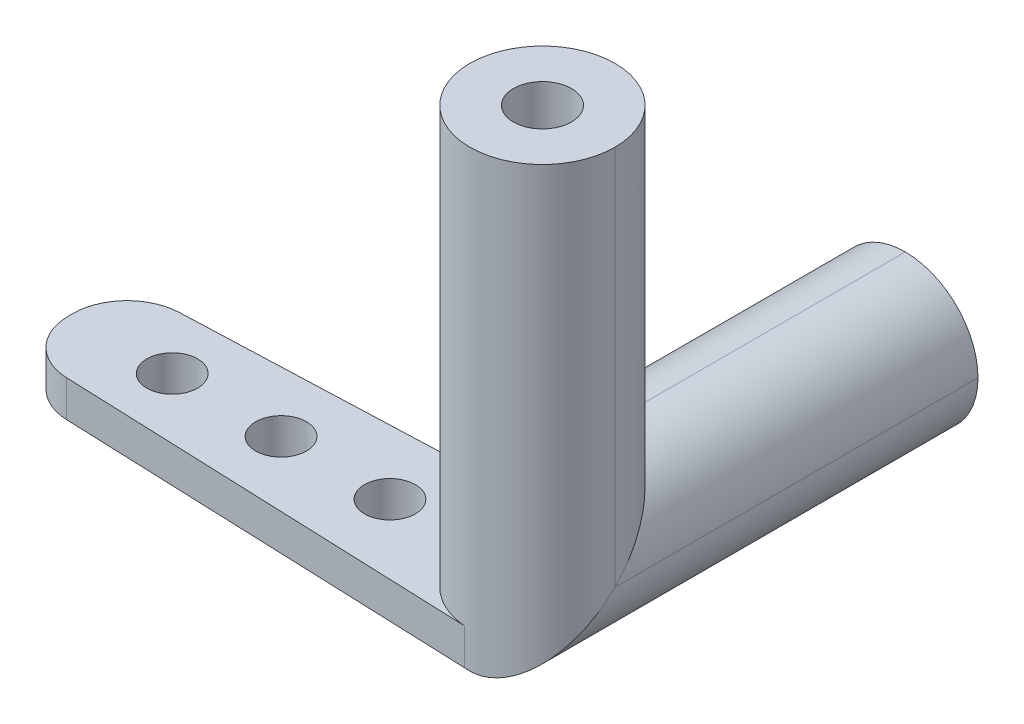
ISO-10303-21;
HEADER;
FILE_DESCRIPTION(('STEP AP214'),'2;1');
FILE_NAME('part.step','',(''),(''),'','','');
FILE_SCHEMA(('AUTOMOTIVE_DESIGN { 1 0 10303 214 1 1 1 1 }'));
ENDSEC;
DATA;
#1=APPLICATION_CONTEXT('core data for automotive mechanical design processes');
#2=APPLICATION_PROTOCOL_DEFINITION('international standard','automotive_design',2000,#1);
#3=PRODUCT_CONTEXT('',#1,'mechanical');
#4=PRODUCT('Part','Part','',(#3));
#5=PRODUCT_RELATED_PRODUCT_CATEGORY('part','',(#4));
#6=PRODUCT_DEFINITION_FORMATION('','',#4);
#7=PRODUCT_DEFINITION_CONTEXT('part definition',#1,'design');
#8=PRODUCT_DEFINITION('design','',#6,#7);
#9=PRODUCT_DEFINITION_SHAPE('','',#8);
#10=(LENGTH_UNIT() NAMED_UNIT(*) SI_UNIT(.MILLI.,.METRE.));
#11=(NAMED_UNIT(*) PLANE_ANGLE_UNIT() SI_UNIT($,.RADIAN.));
#12=(NAMED_UNIT(*) SI_UNIT($,.STERADIAN.) SOLID_ANGLE_UNIT());
#13=UNCERTAINTY_MEASURE_WITH_UNIT(LENGTH_MEASURE(1.E-05),#10,'distance_accuracy_value','');
#14=(GEOMETRIC_REPRESENTATION_CONTEXT(3) GLOBAL_UNCERTAINTY_ASSIGNED_CONTEXT((#13)) GLOBAL_UNIT_ASSIGNED_CONTEXT((#10,
#11,#12)) REPRESENTATION_CONTEXT('',''));
#15=CARTESIAN_POINT('',(0.,0.,0.));
#16=DIRECTION('',(0.,0.,1.));
#17=DIRECTION('',(1.,0.,0.));
#18=AXIS2_PLACEMENT_3D('',#15,#16,#17);
#19=CARTESIAN_POINT('',(2.,2.00000000000001,0.));
#20=DIRECTION('',(0.,0.,-1.));
#21=DIRECTION('',(0.,1.,0.));
#22=AXIS2_PLACEMENT_3D('',#19,#20,#21);
#23=CYLINDRICAL_SURFACE('',#22,2.);
#24=DIRECTION('',(0.,0.,1.));
#25=VECTOR('',#24,1.);
#26=CARTESIAN_POINT('',(2.,0.,-12.));
#27=LINE('',#26,#25);
#28=CARTESIAN_POINT('',(2.,0.,-4.));
#29=VERTEX_POINT('',#28);
#30=CARTESIAN_POINT('',(2.,0.,-12.));
#31=VERTEX_POINT('',#30);
#32=EDGE_CURVE('E399',#29,#31,#27,.F.);
#33=ORIENTED_EDGE('',*,*,#32,.F.);
#34=CARTESIAN_POINT('',(2.,2.,-4.));
#35=DIRECTION('',(0.0384331221012044,0.,0.999261174631314));
#36=DIRECTION('',(0.999261174631314,0.,-0.0384331221012044));
#37=AXIS2_PLACEMENT_3D('',#34,#35,#36);
#38=ELLIPSE('',#37,2.00147874327041,2.);
#39=CARTESIAN_POINT('',(0.26794919243113,0.999999999999994,-3.93338266124735));
#40=VERTEX_POINT('',#39);
#41=EDGE_CURVE('E161',#29,#40,#38,.F.);
#42=ORIENTED_EDGE('',*,*,#41,.T.);
#43=DIRECTION('',(0.,0.,-1.));
#44=VECTOR('',#43,1.);
#45=CARTESIAN_POINT('',(0.26794919243113,1.,0.));
#46=LINE('',#45,#44);
#47=CARTESIAN_POINT('',(0.267949192431128,1.,-0.99999999999999));
#48=VERTEX_POINT('',#47);
#49=EDGE_CURVE('E159',#48,#40,#46,.T.);
#50=ORIENTED_EDGE('',*,*,#49,.F.);
#51=CARTESIAN_POINT('',(2.,2.00000000000001,-2.));
#52=DIRECTION('',(0.,-0.707106781186549,-0.707106781186546));
#53=DIRECTION('',(0.,-0.707106781186546,0.707106781186549));
#54=AXIS2_PLACEMENT_3D('',#51,#52,#53);
#55=ELLIPSE('',#54,2.82842712474619,2.);
#56=CARTESIAN_POINT('',(0.,2.00000000000001,-2.));
#57=VERTEX_POINT('',#56);
#58=EDGE_CURVE('E145',#57,#48,#55,.F.);
#59=ORIENTED_EDGE('',*,*,#58,.F.);
#60=DIRECTION('',(0.,0.,-1.));
#61=VECTOR('',#60,1.);
#62=CARTESIAN_POINT('',(0.,1.99999999999997,-12.));
#63=LINE('',#62,#61);
#64=CARTESIAN_POINT('',(0.,1.99999999999997,-12.));
#65=VERTEX_POINT('',#64);
#66=EDGE_CURVE('E377',#57,#65,#63,.T.);
#67=ORIENTED_EDGE('',*,*,#66,.T.);
#68=CARTESIAN_POINT('',(2.,1.99999999999997,-12.));
#69=DIRECTION('',(0.,0.,-1.));
#70=DIRECTION('',(0.,1.,0.));
#71=AXIS2_PLACEMENT_3D('',#68,#69,#70);
#72=CIRCLE('',#71,2.);
#73=EDGE_CURVE('E386',#31,#65,#72,.T.);
#74=ORIENTED_EDGE('',*,*,#73,.F.);
#75=EDGE_LOOP('',(#33,#42,#50,#59,#67,#74));
#76=FACE_BOUND('',#75,.T.);
#77=ADVANCED_FACE('F43',(#76),#23,.T.);
#78=CARTESIAN_POINT('',(4.,0.,-12.));
#79=DIRECTION('',(0.,0.,-1.));
#80=DIRECTION('',(0.,1.,0.));
#81=AXIS2_PLACEMENT_3D('',#78,#79,#80);
#82=PLANE('',#81);
#83=CARTESIAN_POINT('',(2.,1.99999999999997,-12.));
#84=DIRECTION('',(0.,0.,-1.));
#85=DIRECTION('',(0.,1.,0.));
#86=AXIS2_PLACEMENT_3D('',#83,#84,#85);
#87=CIRCLE('',#86,0.8);
#88=CARTESIAN_POINT('',(2.,2.79999999999997,-12.));
#89=VERTEX_POINT('',#88);
#90=EDGE_CURVE('E188',#89,#89,#87,.T.);
#91=ORIENTED_EDGE('',*,*,#90,.F.);
#92=EDGE_LOOP('',(#91));
#93=FACE_BOUND('',#92,.T.);
#94=CARTESIAN_POINT('',(2.,1.99999999999997,-12.));
#95=DIRECTION('',(0.,0.,-1.));
#96=DIRECTION('',(0.,1.,0.));
#97=AXIS2_PLACEMENT_3D('',#94,#95,#96);
#98=CIRCLE('',#97,2.);
#99=CARTESIAN_POINT('',(2.,3.99999999999997,-12.));
#100=VERTEX_POINT('',#99);
#101=CARTESIAN_POINT('',(4.,1.99999999999997,-12.));
#102=VERTEX_POINT('',#101);
#103=EDGE_CURVE('E380',#100,#102,#98,.T.);
#104=ORIENTED_EDGE('',*,*,#103,.T.);
#105=CARTESIAN_POINT('',(2.,1.99999999999997,-12.));
#106=DIRECTION('',(0.,0.,-1.));
#107=DIRECTION('',(0.,1.,0.));
#108=AXIS2_PLACEMENT_3D('',#105,#106,#107);
#109=CIRCLE('',#108,2.);
#110=EDGE_CURVE('E265',#102,#31,#109,.T.);
#111=ORIENTED_EDGE('',*,*,#110,.T.);
#112=ORIENTED_EDGE('',*,*,#73,.T.);
#113=CARTESIAN_POINT('',(2.,1.99999999999997,-12.));
#114=DIRECTION('',(0.,0.,-1.));
#115=DIRECTION('',(0.,1.,0.));
#116=AXIS2_PLACEMENT_3D('',#113,#114,#115);
#117=CIRCLE('',#116,2.);
#118=EDGE_CURVE('E218',#65,#100,#117,.T.);
#119=ORIENTED_EDGE('',*,*,#118,.T.);
#120=EDGE_LOOP('',(#104,#111,#112,#119));
#121=FACE_BOUND('',#120,.T.);
#122=ADVANCED_FACE('F243',(#93,#121),#82,.T.);
#123=CARTESIAN_POINT('',(4.,12.5,0.));
#124=DIRECTION('',(0.,1.,0.));
#125=DIRECTION('',(0.,0.,1.));
#126=AXIS2_PLACEMENT_3D('',#123,#124,#125);
#127=PLANE('',#126);
#128=CARTESIAN_POINT('',(2.,12.5,-2.));
#129=DIRECTION('',(0.,1.,0.));
#130=DIRECTION('',(0.,0.,1.));
#131=AXIS2_PLACEMENT_3D('',#128,#129,#130);
#132=CIRCLE('',#131,0.8);
#133=CARTESIAN_POINT('',(2.,12.5,-1.2));
#134=VERTEX_POINT('',#133);
#135=EDGE_CURVE('E194',#134,#134,#132,.T.);
#136=ORIENTED_EDGE('',*,*,#135,.F.);
#137=EDGE_LOOP('',(#136));
#138=FACE_BOUND('',#137,.T.);
#139=CARTESIAN_POINT('',(2.,12.5,-2.));
#140=DIRECTION('',(0.,1.,0.));
#141=DIRECTION('',(0.,0.,1.));
#142=AXIS2_PLACEMENT_3D('',#139,#140,#141);
#143=CIRCLE('',#142,2.);
#144=CARTESIAN_POINT('',(0.,12.5,-2.));
#145=VERTEX_POINT('',#144);
#146=CARTESIAN_POINT('',(2.,12.5,0.));
#147=VERTEX_POINT('',#146);
#148=EDGE_CURVE('E198',#145,#147,#143,.T.);
#149=ORIENTED_EDGE('',*,*,#148,.T.);
#150=CARTESIAN_POINT('',(2.,12.5,-2.));
#151=DIRECTION('',(0.,1.,0.));
#152=DIRECTION('',(0.,0.,1.));
#153=AXIS2_PLACEMENT_3D('',#150,#151,#152);
#154=CIRCLE('',#153,2.);
#155=CARTESIAN_POINT('',(4.,12.5,-2.));
#156=VERTEX_POINT('',#155);
#157=EDGE_CURVE('E206',#147,#156,#154,.T.);
#158=ORIENTED_EDGE('',*,*,#157,.T.);
#159=CARTESIAN_POINT('',(2.,12.5,-2.));
#160=DIRECTION('',(0.,1.,0.));
#161=DIRECTION('',(0.,0.,1.));
#162=AXIS2_PLACEMENT_3D('',#159,#160,#161);
#163=CIRCLE('',#162,2.);
#164=CARTESIAN_POINT('',(2.,12.5,-4.));
#165=VERTEX_POINT('',#164);
#166=EDGE_CURVE('E204',#156,#165,#163,.T.);
#167=ORIENTED_EDGE('',*,*,#166,.T.);
#168=CARTESIAN_POINT('',(2.,12.5,-2.));
#169=DIRECTION('',(0.,1.,0.));
#170=DIRECTION('',(0.,0.,1.));
#171=AXIS2_PLACEMENT_3D('',#168,#169,#170);
#172=CIRCLE('',#171,2.);
#173=EDGE_CURVE('E202',#165,#145,#172,.T.);
#174=ORIENTED_EDGE('',*,*,#173,.T.);
#175=EDGE_LOOP('',(#149,#158,#167,#174));
#176=FACE_BOUND('',#175,.T.);
#177=ADVANCED_FACE('F239',(#138,#176),#127,.T.);
#178=CARTESIAN_POINT('',(2.,4.5,-2.));
#179=DIRECTION('',(0.,1.,0.));
#180=DIRECTION('',(0.,0.,1.));
#181=AXIS2_PLACEMENT_3D('',#178,#179,#180);
#182=CYLINDRICAL_SURFACE('',#181,0.8);
#183=CARTESIAN_POINT('',(2.,4.5,-2.));
#184=DIRECTION('',(0.,1.,0.));
#185=DIRECTION('',(0.,0.,1.));
#186=AXIS2_PLACEMENT_3D('',#183,#184,#185);
#187=CIRCLE('',#186,0.8);
#188=CARTESIAN_POINT('',(2.,4.5,-1.2));
#189=VERTEX_POINT('',#188);
#190=EDGE_CURVE('E195',#189,#189,#187,.T.);
#191=ORIENTED_EDGE('',*,*,#190,.F.);
#192=EDGE_LOOP('',(#191));
#193=FACE_BOUND('',#192,.T.);
#194=ORIENTED_EDGE('',*,*,#135,.T.);
#195=EDGE_LOOP('',(#194));
#196=FACE_BOUND('',#195,.T.);
#197=ADVANCED_FACE('F235',(#193,#196),#182,.F.);
#198=CARTESIAN_POINT('',(2.,4.5,-2.));
#199=DIRECTION('',(0.,1.,0.));
#200=DIRECTION('',(0.,0.,1.));
#201=AXIS2_PLACEMENT_3D('',#198,#199,#200);
#202=PLANE('',#201);
#203=ORIENTED_EDGE('',*,*,#190,.T.);
#204=EDGE_LOOP('',(#203));
#205=FACE_BOUND('',#204,.T.);
#206=ADVANCED_FACE('F230',(#205),#202,.T.);
#207=CARTESIAN_POINT('',(2.,3.99999999999999,-2.00000000000001));
#208=DIRECTION('',(0.,-1.,0.));
#209=DIRECTION('',(0.,0.,-1.));
#210=AXIS2_PLACEMENT_3D('',#207,#208,#209);
#211=CYLINDRICAL_SURFACE('',#210,0.8);
#212=CARTESIAN_POINT('',(2.,0.,-2.8));
#213=CARTESIAN_POINT('',(2.02159831677043,-1.86161778139489E-06,-2.8000007467171));
#214=CARTESIAN_POINT('',(2.04318552441436,0.000350269845648966,-2.79912475724533));
#215=CARTESIAN_POINT('',(2.0861904940867,0.00174254682550427,-2.79563599151247));
#216=CARTESIAN_POINT('',(2.10760830440727,0.00278248853754495,-2.7930237297234));
#217=CARTESIAN_POINT('',(2.1712230162056,0.00689257694576577,-2.78263666924842));
#218=CARTESIAN_POINT('',(2.21296956929793,0.0109533376282357,-2.77231125536127));
#219=CARTESIAN_POINT('',(2.29396966864772,0.0213001227870144,-2.74525673480718));
#220=CARTESIAN_POINT('',(2.33322487967818,0.0275846424316137,-2.72853195800847));
#221=CARTESIAN_POINT('',(2.40838776059142,0.0417651950573027,-2.68921650115708));
#222=CARTESIAN_POINT('',(2.44429300078165,0.0496623846525593,-2.66662160784633));
#223=CARTESIAN_POINT('',(2.51340313840996,0.0666769196882176,-2.61510432146704));
#224=CARTESIAN_POINT('',(2.54642877879827,0.0758318229271832,-2.58595409872516));
#225=CARTESIAN_POINT('',(2.60727287497054,0.0941587126501768,-2.52263621997696));
#226=CARTESIAN_POINT('',(2.6350893618162,0.103330704275621,-2.48846667545693));
#227=CARTESIAN_POINT('',(2.68595014063606,0.121108920482231,-2.41422839801925));
#228=CARTESIAN_POINT('',(2.70872645876909,0.129671704971955,-2.37396460765669));
#229=CARTESIAN_POINT('',(2.74710218223958,0.144665539592397,-2.2897845697114));
#230=CARTESIAN_POINT('',(2.76270513755407,0.1510976437197,-2.2458701415017));
#231=CARTESIAN_POINT('',(2.78555941721611,0.160694520611914,-2.15771551436484));
#232=CARTESIAN_POINT('',(2.79315743012602,0.163994250627382,-2.11358042410118));
#233=CARTESIAN_POINT('',(2.80086918031491,0.167343981989817,-2.02454693461503));
#234=CARTESIAN_POINT('',(2.80098644314194,0.167395514156074,-1.97964890493238));
#235=CARTESIAN_POINT('',(2.79399571921285,0.164357986492038,-1.89369697804716));
#236=CARTESIAN_POINT('',(2.78739001505455,0.161487250614816,-1.85259301354298));
#237=CARTESIAN_POINT('',(2.76797853172649,0.153295159109221,-1.77213550619189));
#238=CARTESIAN_POINT('',(2.75517177604126,0.147973417513243,-1.73278224010369));
#239=CARTESIAN_POINT('',(2.72347797855633,0.135362090359313,-1.65599305326941));
#240=CARTESIAN_POINT('',(2.70447215978279,0.128034553809571,-1.61861266723954));
#241=CARTESIAN_POINT('',(2.66100278767393,0.112247615385343,-1.54743399539527));
#242=CARTESIAN_POINT('',(2.63653713229394,0.103787778076929,-1.51363709664094));
#243=CARTESIAN_POINT('',(2.58062203969077,0.0858935895915891,-1.44783808829517));
#244=CARTESIAN_POINT('',(2.54877915271876,0.0764344369430066,-1.41617620820553));
#245=CARTESIAN_POINT('',(2.48012954504219,0.0581617170839124,-1.35852917757767));
#246=CARTESIAN_POINT('',(2.44332126754626,0.0493483536894932,-1.33254581413741));
#247=CARTESIAN_POINT('',(2.36481236770107,0.0331370475106566,-1.28654113459255));
#248=CARTESIAN_POINT('',(2.32302785025109,0.0257713387373306,-1.2666510373912));
#249=CARTESIAN_POINT('',(2.23635571338169,0.0135355319165764,-1.23431925966314));
#250=CARTESIAN_POINT('',(2.19147298414069,0.00866159868195607,-1.22186612762088));
#251=CARTESIAN_POINT('',(2.1217837898764,0.00356516187565962,-1.20894554436054));
#252=CARTESIAN_POINT('',(2.09755880874177,0.00223291958890208,-1.20559469629288));
#253=CARTESIAN_POINT('',(2.04889406824094,0.000449035603605041,-1.20112204101431));
#254=CARTESIAN_POINT('',(2.02445452114523,-3.39533922350434E-06,-1.19999823599307));
#255=CARTESIAN_POINT('',(2.,0.,-1.2));
#256=B_SPLINE_CURVE_WITH_KNOTS('',3,(#212,#213,#214,#215,#216,#217,#218,#219,#220,#221,#222,
#223,#224,#225,#226,#227,#228,#229,#230,#231,#232,#233,#234,#235,#236,#237,#238,#239,#240,#241,
#242,#243,#244,#245,#246,#247,#248,#249,#250,#251,#252,#253,#254,#255),.UNSPECIFIED.,.F.,.F.,(4,
2,2,2,2,2,2,2,2,2,2,2,2,2,2,2,2,2,2,2,2,4),(0.,0.0647526799260257,0.129486181639265,
0.258395674984036,0.387218100767083,0.516133245130554,0.65051918153479,0.784955810610359,
0.925384652578942,1.06574392366057,1.19973726465172,1.33366745643372,1.45827660352849,
1.58290537993168,1.71007812612753,1.8372999187355,1.97434772588188,2.11143860172117,
2.25130229661044,2.39095006889911,2.46432062809039,2.53762533901017),.UNSPECIFIED.);
#257=CARTESIAN_POINT('',(2.,0.,-2.8));
#258=VERTEX_POINT('',#257);
#259=CARTESIAN_POINT('',(2.,0.,-1.2));
#260=VERTEX_POINT('',#259);
#261=EDGE_CURVE('E209',#258,#260,#256,.T.);
#262=ORIENTED_EDGE('',*,*,#261,.T.);
#263=CARTESIAN_POINT('',(2.,0.,-2.));
#264=DIRECTION('',(0.,1.,0.));
#265=DIRECTION('',(0.,0.,1.));
#266=AXIS2_PLACEMENT_3D('',#263,#264,#265);
#267=CIRCLE('',#266,0.8);
#268=EDGE_CURVE('E295',#258,#260,#267,.T.);
#269=ORIENTED_EDGE('',*,*,#268,.F.);
#270=EDGE_LOOP('',(#262,#269));
#271=FACE_BOUND('',#270,.T.);
#272=CARTESIAN_POINT('',(2.,3.99999999999999,-2.00000000000001));
#273=DIRECTION('',(0.,-1.,0.));
#274=DIRECTION('',(0.,0.,-1.));
#275=AXIS2_PLACEMENT_3D('',#272,#273,#274);
#276=CIRCLE('',#275,0.8);
#277=CARTESIAN_POINT('',(2.,3.99999999999999,-2.80000000000001));
#278=VERTEX_POINT('',#277);
#279=EDGE_CURVE('E187',#278,#278,#276,.T.);
#280=ORIENTED_EDGE('',*,*,#279,.F.);
#281=EDGE_LOOP('',(#280));
#282=FACE_BOUND('',#281,.T.);
#283=ADVANCED_FACE('F224',(#271,#282),#211,.F.);
#284=CARTESIAN_POINT('',(2.,3.99999999999999,-2.00000000000001));
#285=DIRECTION('',(0.,-1.,0.));
#286=DIRECTION('',(0.,0.,-1.));
#287=AXIS2_PLACEMENT_3D('',#284,#285,#286);
#288=PLANE('',#287);
#289=ORIENTED_EDGE('',*,*,#279,.T.);
#290=EDGE_LOOP('',(#289));
#291=FACE_BOUND('',#290,.T.);
#292=ADVANCED_FACE('F229',(#291),#288,.T.);
#293=CARTESIAN_POINT('',(2.,2.,-4.00000000000001));
#294=DIRECTION('',(0.,0.,-1.));
#295=DIRECTION('',(0.,1.,0.));
#296=AXIS2_PLACEMENT_3D('',#293,#294,#295);
#297=CYLINDRICAL_SURFACE('',#296,0.8);
#298=CARTESIAN_POINT('',(2.,2.,-4.00000000000001));
#299=DIRECTION('',(0.,0.,-1.));
#300=DIRECTION('',(0.,1.,0.));
#301=AXIS2_PLACEMENT_3D('',#298,#299,#300);
#302=CIRCLE('',#301,0.8);
#303=CARTESIAN_POINT('',(2.,2.8,-4.00000000000001));
#304=VERTEX_POINT('',#303);
#305=EDGE_CURVE('E184',#304,#304,#302,.T.);
#306=ORIENTED_EDGE('',*,*,#305,.F.);
#307=EDGE_LOOP('',(#306));
#308=FACE_BOUND('',#307,.T.);
#309=ORIENTED_EDGE('',*,*,#90,.T.);
#310=EDGE_LOOP('',(#309));
#311=FACE_BOUND('',#310,.T.);
#312=ADVANCED_FACE('F367',(#308,#311),#297,.F.);
#313=CARTESIAN_POINT('',(2.,2.,-4.00000000000001));
#314=DIRECTION('',(0.,0.,-1.));
#315=DIRECTION('',(0.,1.,0.));
#316=AXIS2_PLACEMENT_3D('',#313,#314,#315);
#317=PLANE('',#316);
#318=ORIENTED_EDGE('',*,*,#305,.T.);
#319=EDGE_LOOP('',(#318));
#320=FACE_BOUND('',#319,.T.);
#321=ADVANCED_FACE('F361',(#320),#317,.T.);
#322=CARTESIAN_POINT('',(2.,2.00000000000002,0.));
#323=DIRECTION('',(0.,0.,1.));
#324=DIRECTION('',(0.,-1.,0.));
#325=AXIS2_PLACEMENT_3D('',#322,#323,#324);
#326=CYLINDRICAL_SURFACE('',#325,2.);
#327=DIRECTION('',(0.,0.,-1.));
#328=VECTOR('',#327,1.);
#329=CARTESIAN_POINT('',(2.,4.,-4.));
#330=LINE('',#329,#328);
#331=CARTESIAN_POINT('',(2.,4.,-4.));
#332=VERTEX_POINT('',#331);
#333=EDGE_CURVE('E191',#100,#332,#330,.F.);
#334=ORIENTED_EDGE('',*,*,#333,.F.);
#335=ORIENTED_EDGE('',*,*,#118,.F.);
#336=ORIENTED_EDGE('',*,*,#66,.F.);
#337=CARTESIAN_POINT('',(2.,2.00000000000001,-2.));
#338=DIRECTION('',(0.,0.707106781186549,0.707106781186546));
#339=DIRECTION('',(0.,0.707106781186546,-0.707106781186549));
#340=AXIS2_PLACEMENT_3D('',#337,#338,#339);
#341=ELLIPSE('',#340,2.82842712474619,2.);
#342=EDGE_CURVE('E375',#332,#57,#341,.T.);
#343=ORIENTED_EDGE('',*,*,#342,.F.);
#344=EDGE_LOOP('',(#334,#335,#336,#343));
#345=FACE_BOUND('',#344,.T.);
#346=ADVANCED_FACE('F358',(#345),#326,.T.);
#347=CARTESIAN_POINT('',(2.,2.00000000000002,0.));
#348=DIRECTION('',(0.,0.,-1.));
#349=DIRECTION('',(0.,1.,0.));
#350=AXIS2_PLACEMENT_3D('',#347,#348,#349);
#351=CYLINDRICAL_SURFACE('',#350,2.);
#352=ORIENTED_EDGE('',*,*,#103,.F.);
#353=ORIENTED_EDGE('',*,*,#333,.T.);
#354=CARTESIAN_POINT('',(2.,2.00000000000001,-2.));
#355=DIRECTION('',(0.,-0.707106781186549,-0.707106781186546));
#356=DIRECTION('',(0.,-0.707106781186546,0.707106781186549));
#357=AXIS2_PLACEMENT_3D('',#354,#355,#356);
#358=ELLIPSE('',#357,2.82842712474619,2.);
#359=CARTESIAN_POINT('',(4.,2.00000000000001,-2.));
#360=VERTEX_POINT('',#359);
#361=EDGE_CURVE('E401',#360,#332,#358,.F.);
#362=ORIENTED_EDGE('',*,*,#361,.F.);
#363=DIRECTION('',(0.,0.,-1.));
#364=VECTOR('',#363,1.);
#365=CARTESIAN_POINT('',(4.,2.00000000000002,0.));
#366=LINE('',#365,#364);
#367=EDGE_CURVE('E382',#102,#360,#366,.F.);
#368=ORIENTED_EDGE('',*,*,#367,.F.);
#369=EDGE_LOOP('',(#352,#353,#362,#368));
#370=FACE_BOUND('',#369,.T.);
#371=ADVANCED_FACE('F355',(#370),#351,.T.);
#372=CARTESIAN_POINT('',(2.,0.,-2.));
#373=DIRECTION('',(0.,1.,0.));
#374=DIRECTION('',(0.,0.,1.));
#375=AXIS2_PLACEMENT_3D('',#372,#373,#374);
#376=CYLINDRICAL_SURFACE('',#375,2.);
#377=DIRECTION('',(0.,1.,0.));
#378=VECTOR('',#377,1.);
#379=CARTESIAN_POINT('',(0.,0.,-2.));
#380=LINE('',#379,#378);
#381=EDGE_CURVE('E153',#145,#57,#380,.F.);
#382=ORIENTED_EDGE('',*,*,#381,.F.);
#383=ORIENTED_EDGE('',*,*,#173,.F.);
#384=DIRECTION('',(0.,1.,0.));
#385=VECTOR('',#384,1.);
#386=CARTESIAN_POINT('',(2.,0.,-4.));
#387=LINE('',#386,#385);
#388=EDGE_CURVE('E404',#332,#165,#387,.T.);
#389=ORIENTED_EDGE('',*,*,#388,.F.);
#390=ORIENTED_EDGE('',*,*,#342,.T.);
#391=EDGE_LOOP('',(#382,#383,#389,#390));
#392=FACE_BOUND('',#391,.T.);
#393=ADVANCED_FACE('F354',(#392),#376,.T.);
#394=CARTESIAN_POINT('',(2.,0.,-2.));
#395=DIRECTION('',(0.,-1.,0.));
#396=DIRECTION('',(0.,0.,-1.));
#397=AXIS2_PLACEMENT_3D('',#394,#395,#396);
#398=CYLINDRICAL_SURFACE('',#397,2.);
#399=ORIENTED_EDGE('',*,*,#388,.T.);
#400=ORIENTED_EDGE('',*,*,#166,.F.);
#401=DIRECTION('',(0.,1.,0.));
#402=VECTOR('',#401,1.);
#403=CARTESIAN_POINT('',(4.,12.5,-2.));
#404=LINE('',#403,#402);
#405=EDGE_CURVE('E393',#360,#156,#404,.T.);
#406=ORIENTED_EDGE('',*,*,#405,.F.);
#407=ORIENTED_EDGE('',*,*,#361,.T.);
#408=EDGE_LOOP('',(#399,#400,#406,#407));
#409=FACE_BOUND('',#408,.T.);
#410=ADVANCED_FACE('F484',(#409),#398,.T.);
#411=CARTESIAN_POINT('',(2.,2.00000000000001,0.));
#412=DIRECTION('',(0.,0.,1.));
#413=DIRECTION('',(0.,-1.,0.));
#414=AXIS2_PLACEMENT_3D('',#411,#412,#413);
#415=CYLINDRICAL_SURFACE('',#414,2.);
#416=ORIENTED_EDGE('',*,*,#110,.F.);
#417=ORIENTED_EDGE('',*,*,#367,.T.);
#418=CARTESIAN_POINT('',(2.,2.00000000000001,-2.));
#419=DIRECTION('',(0.,0.707106781186549,0.707106781186546));
#420=DIRECTION('',(0.,-0.707106781186546,0.707106781186549));
#421=AXIS2_PLACEMENT_3D('',#418,#419,#420);
#422=ELLIPSE('',#421,2.82842712474619,2.);
#423=CARTESIAN_POINT('',(2.,0.,0.));
#424=VERTEX_POINT('',#423);
#425=EDGE_CURVE('E392',#424,#360,#422,.T.);
#426=ORIENTED_EDGE('',*,*,#425,.F.);
#427=DIRECTION('',(0.,0.,1.));
#428=VECTOR('',#427,1.);
#429=CARTESIAN_POINT('',(2.,0.,-12.));
#430=LINE('',#429,#428);
#431=EDGE_CURVE('E156',#424,#260,#430,.F.);
#432=ORIENTED_EDGE('',*,*,#431,.T.);
#433=ORIENTED_EDGE('',*,*,#261,.F.);
#434=EDGE_CURVE('E396',#258,#29,#27,.F.);
#435=ORIENTED_EDGE('',*,*,#434,.T.);
#436=ORIENTED_EDGE('',*,*,#32,.T.);
#437=EDGE_LOOP('',(#416,#417,#426,#432,#433,#435,#436));
#438=FACE_BOUND('',#437,.T.);
#439=ADVANCED_FACE('F220',(#438),#415,.T.);
#440=CARTESIAN_POINT('',(2.,0.,-2.));
#441=DIRECTION('',(0.,-1.,0.));
#442=DIRECTION('',(0.,0.,-1.));
#443=AXIS2_PLACEMENT_3D('',#440,#441,#442);
#444=CYLINDRICAL_SURFACE('',#443,2.);
#445=DIRECTION('',(0.,-1.,0.));
#446=VECTOR('',#445,1.);
#447=CARTESIAN_POINT('',(1.8463810930576,0.,-0.00590841949778489));
#448=LINE('',#447,#446);
#449=CARTESIAN_POINT('',(1.8463810930576,0.00590841949779783,-0.00590841949778481));
#450=VERTEX_POINT('',#449);
#451=CARTESIAN_POINT('',(1.8463810930576,1.,-0.00590841949778445));
#452=VERTEX_POINT('',#451);
#453=EDGE_CURVE('E162',#450,#452,#448,.F.);
#454=ORIENTED_EDGE('',*,*,#453,.F.);
#455=CARTESIAN_POINT('',(2.,0.,0.));
#456=CARTESIAN_POINT('',(1.92307692307693,0.,-0.00295857988165671));
#457=CARTESIAN_POINT('',(1.8463810930576,0.00590841949779826,-0.00590841949778444));
#458=B_SPLINE_CURVE_WITH_KNOTS('',2,(#455,#456,#457),.UNSPECIFIED.,.F.,.F.,(3,3),(0.,1.),.UNSPECIFIED.);
#459=EDGE_CURVE('E181',#424,#450,#458,.T.);
#460=ORIENTED_EDGE('',*,*,#459,.F.);
#461=ORIENTED_EDGE('',*,*,#425,.T.);
#462=ORIENTED_EDGE('',*,*,#405,.T.);
#463=ORIENTED_EDGE('',*,*,#157,.F.);
#464=DIRECTION('',(0.,1.,0.));
#465=VECTOR('',#464,1.);
#466=CARTESIAN_POINT('',(2.,0.,0.));
#467=LINE('',#466,#465);
#468=CARTESIAN_POINT('',(2.,1.,0.));
#469=VERTEX_POINT('',#468);
#470=EDGE_CURVE('E390',#147,#469,#467,.F.);
#471=ORIENTED_EDGE('',*,*,#470,.T.);
#472=ORIENTED_EDGE('',*,*,#470,.F.);
#473=ORIENTED_EDGE('',*,*,#148,.F.);
#474=ORIENTED_EDGE('',*,*,#381,.T.);
#475=ORIENTED_EDGE('',*,*,#58,.T.);
#476=CARTESIAN_POINT('',(2.,1.,-2.));
#477=DIRECTION('',(0.,1.,0.));
#478=DIRECTION('',(0.,0.,1.));
#479=AXIS2_PLACEMENT_3D('',#476,#477,#478);
#480=CIRCLE('',#479,2.);
#481=EDGE_CURVE('E149',#452,#48,#480,.F.);
#482=ORIENTED_EDGE('',*,*,#481,.F.);
#483=EDGE_LOOP('',(#454,#460,#461,#462,#463,#471,#472,#473,#474,#475,#482));
#484=FACE_BOUND('',#483,.T.);
#485=ADVANCED_FACE('F147',(#484),#444,.T.);
#486=CARTESIAN_POINT('',(-0.150664697193501,1.,-3.91728212703102));
#487=DIRECTION('',(0.0384331221012044,0.,0.999261174631314));
#488=DIRECTION('',(0.999261174631314,0.,-0.0384331221012044));
#489=AXIS2_PLACEMENT_3D('',#486,#487,#488);
#490=PLANE('',#489);
#491=DIRECTION('',(-0.999261174631314,0.,0.0384331221012044));
#492=VECTOR('',#491,1.);
#493=CARTESIAN_POINT('',(-0.150664697193501,0.,-3.91728212703102));
#494=LINE('',#493,#492);
#495=CARTESIAN_POINT('',(-9.5576496831518,0.,-3.55547501218647));
#496=VERTEX_POINT('',#495);
#497=EDGE_CURVE('E293',#29,#496,#494,.T.);
#498=ORIENTED_EDGE('',*,*,#497,.T.);
#499=DIRECTION('',(0.,-1.,0.));
#500=VECTOR('',#499,1.);
#501=CARTESIAN_POINT('',(-9.5576496831518,1.,-3.55547501218647));
#502=LINE('',#501,#500);
#503=CARTESIAN_POINT('',(-9.5576496831518,1.,-3.55547501218647));
#504=VERTEX_POINT('',#503);
#505=EDGE_CURVE('E11',#496,#504,#502,.F.);
#506=ORIENTED_EDGE('',*,*,#505,.T.);
#507=DIRECTION('',(-0.999261174631314,0.,0.0384331221012044));
#508=VECTOR('',#507,1.);
#509=CARTESIAN_POINT('',(-0.150664697193501,1.,-3.91728212703102));
#510=LINE('',#509,#508);
#511=EDGE_CURVE('E294',#40,#504,#510,.T.);
#512=ORIENTED_EDGE('',*,*,#511,.F.);
#513=ORIENTED_EDGE('',*,*,#41,.F.);
#514=EDGE_LOOP('',(#498,#506,#512,#513));
#515=FACE_BOUND('',#514,.T.);
#516=ADVANCED_FACE('F249',(#515),#490,.F.);
#517=CARTESIAN_POINT('',(-11.,1.,0.));
#518=DIRECTION('',(-1.,0.,0.));
#519=DIRECTION('',(0.,0.,1.));
#520=AXIS2_PLACEMENT_3D('',#517,#518,#519);
#521=PLANE('',#520);
#522=DIRECTION('',(0.,0.,-1.));
#523=VECTOR('',#522,1.);
#524=CARTESIAN_POINT('',(-11.,0.,0.));
#525=LINE('',#524,#523);
#526=CARTESIAN_POINT('',(-11.,0.,-1.9434167497605));
#527=VERTEX_POINT('',#526);
#528=CARTESIAN_POINT('',(-11.,0.,-2.0565832502395));
#529=VERTEX_POINT('',#528);
#530=EDGE_CURVE('E172',#527,#529,#525,.T.);
#531=ORIENTED_EDGE('',*,*,#530,.F.);
#532=DIRECTION('',(0.,-1.,0.));
#533=VECTOR('',#532,1.);
#534=CARTESIAN_POINT('',(-11.,1.,-1.9434167497605));
#535=LINE('',#534,#533);
#536=CARTESIAN_POINT('',(-11.,1.,-1.9434167497605));
#537=VERTEX_POINT('',#536);
#538=EDGE_CURVE('E272',#527,#537,#535,.F.);
#539=ORIENTED_EDGE('',*,*,#538,.T.);
#540=DIRECTION('',(0.,0.,-1.));
#541=VECTOR('',#540,1.);
#542=CARTESIAN_POINT('',(-11.,1.,0.));
#543=LINE('',#542,#541);
#544=CARTESIAN_POINT('',(-11.,1.,-2.0565832502395));
#545=VERTEX_POINT('',#544);
#546=EDGE_CURVE('E169',#537,#545,#543,.T.);
#547=ORIENTED_EDGE('',*,*,#546,.T.);
#548=DIRECTION('',(0.,-1.,0.));
#549=VECTOR('',#548,1.);
#550=CARTESIAN_POINT('',(-11.,0.,-2.0565832502395));
#551=LINE('',#550,#549);
#552=EDGE_CURVE('E269',#545,#529,#551,.T.);
#553=ORIENTED_EDGE('',*,*,#552,.T.);
#554=EDGE_LOOP('',(#531,#539,#547,#553));
#555=FACE_BOUND('',#554,.T.);
#556=ADVANCED_FACE('F291',(#555),#521,.T.);
#557=CARTESIAN_POINT('',(0.00295420974889217,1.,-0.0768094534711965));
#558=DIRECTION('',(-0.0384331221012044,0.,0.999261174631314));
#559=DIRECTION('',(0.999261174631314,0.,0.0384331221012044));
#560=AXIS2_PLACEMENT_3D('',#557,#558,#559);
#561=PLANE('',#560);
#562=DIRECTION('',(-0.999261174631314,0.,-0.0384331221012044));
#563=VECTOR('',#562,1.);
#564=CARTESIAN_POINT('',(0.00295420974889217,1.,-0.0768094534711965));
#565=LINE('',#564,#563);
#566=CARTESIAN_POINT('',(-9.5576496831518,1.,-0.444524987813531));
#567=VERTEX_POINT('',#566);
#568=EDGE_CURVE('E167',#452,#567,#565,.T.);
#569=ORIENTED_EDGE('',*,*,#568,.T.);
#570=DIRECTION('',(0.,-1.,0.));
#571=VECTOR('',#570,1.);
#572=CARTESIAN_POINT('',(-9.55764968315181,1.,-0.444524987813531));
#573=LINE('',#572,#571);
#574=CARTESIAN_POINT('',(-9.5576496831518,0.,-0.444524987813531));
#575=VERTEX_POINT('',#574);
#576=EDGE_CURVE('E256',#567,#575,#573,.T.);
#577=ORIENTED_EDGE('',*,*,#576,.T.);
#578=DIRECTION('',(-0.999261174631314,0.,-0.0384331221012044));
#579=VECTOR('',#578,1.);
#580=CARTESIAN_POINT('',(0.00295420974889217,0.,-0.0768094534711965));
#581=LINE('',#580,#579);
#582=EDGE_CURVE('E289',#424,#575,#581,.T.);
#583=ORIENTED_EDGE('',*,*,#582,.F.);
#584=ORIENTED_EDGE('',*,*,#459,.T.);
#585=ORIENTED_EDGE('',*,*,#453,.T.);
#586=EDGE_LOOP('',(#569,#577,#583,#584,#585));
#587=FACE_BOUND('',#586,.T.);
#588=ADVANCED_FACE('F279',(#587),#561,.T.);
#589=CARTESIAN_POINT('',(0.,1.,0.));
#590=DIRECTION('',(0.,1.,0.));
#591=DIRECTION('',(0.,0.,1.));
#592=AXIS2_PLACEMENT_3D('',#589,#590,#591);
#593=PLANE('',#592);
#594=CARTESIAN_POINT('',(-2.2,1.,-2.));
#595=DIRECTION('',(0.,1.,0.));
#596=DIRECTION('',(0.,0.,1.));
#597=AXIS2_PLACEMENT_3D('',#594,#595,#596);
#598=CIRCLE('',#597,0.7);
#599=CARTESIAN_POINT('',(-2.2,1.,-1.3));
#600=VERTEX_POINT('',#599);
#601=EDGE_CURVE('E313',#600,#600,#598,.T.);
#602=ORIENTED_EDGE('',*,*,#601,.F.);
#603=EDGE_LOOP('',(#602));
#604=FACE_BOUND('',#603,.T.);
#605=CARTESIAN_POINT('',(-5.2,1.,-2.));
#606=DIRECTION('',(0.,1.,0.));
#607=DIRECTION('',(0.,0.,1.));
#608=AXIS2_PLACEMENT_3D('',#605,#606,#607);
#609=CIRCLE('',#608,0.7);
#610=CARTESIAN_POINT('',(-5.2,1.,-1.3));
#611=VERTEX_POINT('',#610);
#612=EDGE_CURVE('E310',#611,#611,#609,.T.);
#613=ORIENTED_EDGE('',*,*,#612,.F.);
#614=EDGE_LOOP('',(#613));
#615=FACE_BOUND('',#614,.T.);
#616=CARTESIAN_POINT('',(-8.2,1.,-2.));
#617=DIRECTION('',(0.,1.,0.));
#618=DIRECTION('',(0.,0.,1.));
#619=AXIS2_PLACEMENT_3D('',#616,#617,#618);
#620=CIRCLE('',#619,0.7);
#621=CARTESIAN_POINT('',(-8.2,1.,-1.3));
#622=VERTEX_POINT('',#621);
#623=EDGE_CURVE('E303',#622,#622,#620,.T.);
#624=ORIENTED_EDGE('',*,*,#623,.F.);
#625=EDGE_LOOP('',(#624));
#626=FACE_BOUND('',#625,.T.);
#627=ORIENTED_EDGE('',*,*,#546,.F.);
#628=CARTESIAN_POINT('',(-9.5,1.,-1.9434167497605));
#629=DIRECTION('',(0.,1.,0.));
#630=DIRECTION('',(0.,0.,1.));
#631=AXIS2_PLACEMENT_3D('',#628,#629,#630);
#632=CIRCLE('',#631,1.5);
#633=EDGE_CURVE('E51',#537,#567,#632,.T.);
#634=ORIENTED_EDGE('',*,*,#633,.T.);
#635=ORIENTED_EDGE('',*,*,#568,.F.);
#636=ORIENTED_EDGE('',*,*,#481,.T.);
#637=ORIENTED_EDGE('',*,*,#49,.T.);
#638=ORIENTED_EDGE('',*,*,#511,.T.);
#639=CARTESIAN_POINT('',(-9.5,1.,-2.0565832502395));
#640=DIRECTION('',(0.,1.,0.));
#641=DIRECTION('',(0.,0.,1.));
#642=AXIS2_PLACEMENT_3D('',#639,#640,#641);
#643=CIRCLE('',#642,1.5);
#644=EDGE_CURVE('E63',#504,#545,#643,.T.);
#645=ORIENTED_EDGE('',*,*,#644,.T.);
#646=EDGE_LOOP('',(#627,#634,#635,#636,#637,#638,#645));
#647=FACE_BOUND('',#646,.T.);
#648=ADVANCED_FACE('F165',(#604,#615,#626,#647),#593,.T.);
#649=CARTESIAN_POINT('',(0.,0.,0.));
#650=DIRECTION('',(0.,1.,0.));
#651=DIRECTION('',(0.,0.,1.));
#652=AXIS2_PLACEMENT_3D('',#649,#650,#651);
#653=PLANE('',#652);
#654=CARTESIAN_POINT('',(-2.2,0.,-2.));
#655=DIRECTION('',(0.,1.,0.));
#656=DIRECTION('',(0.,0.,1.));
#657=AXIS2_PLACEMENT_3D('',#654,#655,#656);
#658=CIRCLE('',#657,0.7);
#659=CARTESIAN_POINT('',(-2.2,0.,-1.3));
#660=VERTEX_POINT('',#659);
#661=EDGE_CURVE('E298',#660,#660,#658,.F.);
#662=ORIENTED_EDGE('',*,*,#661,.F.);
#663=EDGE_LOOP('',(#662));
#664=FACE_BOUND('',#663,.T.);
#665=CARTESIAN_POINT('',(-5.2,0.,-2.));
#666=DIRECTION('',(0.,1.,0.));
#667=DIRECTION('',(0.,0.,1.));
#668=AXIS2_PLACEMENT_3D('',#665,#666,#667);
#669=CIRCLE('',#668,0.7);
#670=CARTESIAN_POINT('',(-5.2,0.,-1.3));
#671=VERTEX_POINT('',#670);
#672=EDGE_CURVE('E306',#671,#671,#669,.F.);
#673=ORIENTED_EDGE('',*,*,#672,.F.);
#674=EDGE_LOOP('',(#673));
#675=FACE_BOUND('',#674,.T.);
#676=CARTESIAN_POINT('',(-8.2,0.,-2.));
#677=DIRECTION('',(0.,1.,0.));
#678=DIRECTION('',(0.,0.,1.));
#679=AXIS2_PLACEMENT_3D('',#676,#677,#678);
#680=CIRCLE('',#679,0.7);
#681=CARTESIAN_POINT('',(-8.2,0.,-1.3));
#682=VERTEX_POINT('',#681);
#683=EDGE_CURVE('E307',#682,#682,#680,.F.);
#684=ORIENTED_EDGE('',*,*,#683,.F.);
#685=EDGE_LOOP('',(#684));
#686=FACE_BOUND('',#685,.T.);
#687=ORIENTED_EDGE('',*,*,#582,.T.);
#688=CARTESIAN_POINT('',(-9.5,0.,-1.9434167497605));
#689=DIRECTION('',(0.,1.,0.));
#690=DIRECTION('',(0.,0.,1.));
#691=AXIS2_PLACEMENT_3D('',#688,#689,#690);
#692=CIRCLE('',#691,1.5);
#693=EDGE_CURVE('E267',#575,#527,#692,.F.);
#694=ORIENTED_EDGE('',*,*,#693,.T.);
#695=ORIENTED_EDGE('',*,*,#530,.T.);
#696=CARTESIAN_POINT('',(-9.5,0.,-2.0565832502395));
#697=DIRECTION('',(0.,1.,0.));
#698=DIRECTION('',(0.,0.,1.));
#699=AXIS2_PLACEMENT_3D('',#696,#697,#698);
#700=CIRCLE('',#699,1.5);
#701=EDGE_CURVE('E264',#529,#496,#700,.F.);
#702=ORIENTED_EDGE('',*,*,#701,.T.);
#703=ORIENTED_EDGE('',*,*,#497,.F.);
#704=ORIENTED_EDGE('',*,*,#434,.F.);
#705=ORIENTED_EDGE('',*,*,#268,.T.);
#706=ORIENTED_EDGE('',*,*,#431,.F.);
#707=EDGE_LOOP('',(#687,#694,#695,#702,#703,#704,#705,#706));
#708=FACE_BOUND('',#707,.T.);
#709=ADVANCED_FACE('F287',(#664,#675,#686,#708),#653,.F.);
#710=CARTESIAN_POINT('',(-9.5,1.,-1.9434167497605));
#711=DIRECTION('',(0.,-1.,0.));
#712=DIRECTION('',(0.,0.,-1.));
#713=AXIS2_PLACEMENT_3D('',#710,#711,#712);
#714=CYLINDRICAL_SURFACE('',#713,1.5);
#715=ORIENTED_EDGE('',*,*,#633,.F.);
#716=ORIENTED_EDGE('',*,*,#538,.F.);
#717=ORIENTED_EDGE('',*,*,#693,.F.);
#718=ORIENTED_EDGE('',*,*,#576,.F.);
#719=EDGE_LOOP('',(#715,#716,#717,#718));
#720=FACE_BOUND('',#719,.T.);
#721=ADVANCED_FACE('F283',(#720),#714,.T.);
#722=CARTESIAN_POINT('',(-9.5,1.,-2.0565832502395));
#723=DIRECTION('',(0.,1.,0.));
#724=DIRECTION('',(0.,0.,1.));
#725=AXIS2_PLACEMENT_3D('',#722,#723,#724);
#726=CYLINDRICAL_SURFACE('',#725,1.5);
#727=ORIENTED_EDGE('',*,*,#644,.F.);
#728=ORIENTED_EDGE('',*,*,#505,.F.);
#729=ORIENTED_EDGE('',*,*,#701,.F.);
#730=ORIENTED_EDGE('',*,*,#552,.F.);
#731=EDGE_LOOP('',(#727,#728,#729,#730));
#732=FACE_BOUND('',#731,.T.);
#733=ADVANCED_FACE('F45',(#732),#726,.T.);
#734=CARTESIAN_POINT('',(-8.2,-0.0120109325238184,-2.));
#735=DIRECTION('',(0.,1.,0.));
#736=DIRECTION('',(0.,0.,1.));
#737=AXIS2_PLACEMENT_3D('',#734,#735,#736);
#738=CYLINDRICAL_SURFACE('',#737,0.7);
#739=ORIENTED_EDGE('',*,*,#623,.T.);
#740=EDGE_LOOP('',(#739));
#741=FACE_BOUND('',#740,.T.);
#742=ORIENTED_EDGE('',*,*,#683,.T.);
#743=EDGE_LOOP('',(#742));
#744=FACE_BOUND('',#743,.T.);
#745=ADVANCED_FACE('F331',(#741,#744),#738,.F.);
#746=CARTESIAN_POINT('',(-5.2,-0.0120109325238184,-2.));
#747=DIRECTION('',(0.,1.,0.));
#748=DIRECTION('',(0.,0.,1.));
#749=AXIS2_PLACEMENT_3D('',#746,#747,#748);
#750=CYLINDRICAL_SURFACE('',#749,0.7);
#751=ORIENTED_EDGE('',*,*,#612,.T.);
#752=EDGE_LOOP('',(#751));
#753=FACE_BOUND('',#752,.T.);
#754=ORIENTED_EDGE('',*,*,#672,.T.);
#755=EDGE_LOOP('',(#754));
#756=FACE_BOUND('',#755,.T.);
#757=ADVANCED_FACE('F334',(#753,#756),#750,.F.);
#758=CARTESIAN_POINT('',(-2.2,-0.0120109325238184,-2.));
#759=DIRECTION('',(0.,1.,0.));
#760=DIRECTION('',(0.,0.,1.));
#761=AXIS2_PLACEMENT_3D('',#758,#759,#760);
#762=CYLINDRICAL_SURFACE('',#761,0.7);
#763=ORIENTED_EDGE('',*,*,#601,.T.);
#764=EDGE_LOOP('',(#763));
#765=FACE_BOUND('',#764,.T.);
#766=ORIENTED_EDGE('',*,*,#661,.T.);
#767=EDGE_LOOP('',(#766));
#768=FACE_BOUND('',#767,.T.);
#769=ADVANCED_FACE('F321',(#765,#768),#762,.F.);
#770=CLOSED_SHELL('',(#77,#122,#177,#197,#206,#283,#292,#312,#321,#346,#371,#393,#410,#439,#485,
#516,#556,#588,#648,#709,#721,#733,#745,#757,#769));
#771=MANIFOLD_SOLID_BREP('B2',#770);
#772=ADVANCED_BREP_SHAPE_REPRESENTATION('',(#18,#771),#14);
#773=SHAPE_DEFINITION_REPRESENTATION(#9,#772);
ENDSEC;
END-ISO-10303-21;
